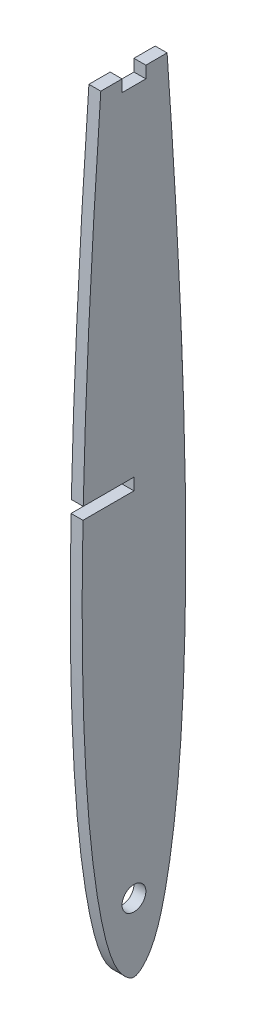
ISO-10303-21;
HEADER;
FILE_DESCRIPTION(('STEP AP214'),'2;1');
FILE_NAME('part.step','',(''),(''),'','','');
FILE_SCHEMA(('AUTOMOTIVE_DESIGN { 1 0 10303 214 1 1 1 1 }'));
ENDSEC;
DATA;
#1=APPLICATION_CONTEXT('core data for automotive mechanical design processes');
#2=APPLICATION_PROTOCOL_DEFINITION('international standard','automotive_design',2000,#1);
#3=PRODUCT_CONTEXT('',#1,'mechanical');
#4=PRODUCT('Part','Part','',(#3));
#5=PRODUCT_RELATED_PRODUCT_CATEGORY('part','',(#4));
#6=PRODUCT_DEFINITION_FORMATION('','',#4);
#7=PRODUCT_DEFINITION_CONTEXT('part definition',#1,'design');
#8=PRODUCT_DEFINITION('design','',#6,#7);
#9=PRODUCT_DEFINITION_SHAPE('','',#8);
#10=(LENGTH_UNIT() NAMED_UNIT(*) SI_UNIT(.MILLI.,.METRE.));
#11=(NAMED_UNIT(*) PLANE_ANGLE_UNIT() SI_UNIT($,.RADIAN.));
#12=(NAMED_UNIT(*) SI_UNIT($,.STERADIAN.) SOLID_ANGLE_UNIT());
#13=UNCERTAINTY_MEASURE_WITH_UNIT(LENGTH_MEASURE(1.E-05),#10,'distance_accuracy_value','');
#14=(GEOMETRIC_REPRESENTATION_CONTEXT(3) GLOBAL_UNCERTAINTY_ASSIGNED_CONTEXT((#13)) GLOBAL_UNIT_ASSIGNED_CONTEXT((#10,
#11,#12)) REPRESENTATION_CONTEXT('',''));
#15=CARTESIAN_POINT('',(0.,0.,0.));
#16=DIRECTION('',(0.,0.,1.));
#17=DIRECTION('',(1.,0.,0.));
#18=AXIS2_PLACEMENT_3D('',#15,#16,#17);
#19=CARTESIAN_POINT('',(2.,192.999999999996,0.));
#20=CARTESIAN_POINT('',(2.,192.999999999996,0.0122882837324172));
#21=CARTESIAN_POINT('',(2.,192.682209119406,0.0368603625393233));
#22=CARTESIAN_POINT('',(2.,192.460340024893,0.0736035981280797));
#23=CARTESIAN_POINT('',(2.,191.982517082908,0.134145604404998));
#24=CARTESIAN_POINT('',(2.,191.35712689456,0.216837902660677));
#25=CARTESIAN_POINT('',(2.,190.531582794813,0.320148771963968));
#26=CARTESIAN_POINT('',(2.,189.535054466325,0.442734222230249));
#27=CARTESIAN_POINT('',(2.,188.359470772641,0.583708337911787));
#28=CARTESIAN_POINT('',(2.,187.007350915561,0.741224014677529));
#29=CARTESIAN_POINT('',(2.,185.485486568902,0.913427429630669));
#30=CARTESIAN_POINT('',(2.,183.794042276915,1.09836703243003));
#31=CARTESIAN_POINT('',(2.,181.932788992912,1.29515347410631));
#32=CARTESIAN_POINT('',(2.,179.912860558566,1.50300146250267));
#33=CARTESIAN_POINT('',(2.,177.734330299035,1.72214268387852));
#34=CARTESIAN_POINT('',(2.,175.397073133111,1.95164554564491));
#35=CARTESIAN_POINT('',(2.,172.914023798966,2.18986236397919));
#36=CARTESIAN_POINT('',(2.,170.285170029632,2.4360379785976));
#37=CARTESIAN_POINT('',(2.,167.510432908496,2.68976393685841));
#38=CARTESIAN_POINT('',(2.,164.606175429361,2.9497692630301));
#39=CARTESIAN_POINT('',(2.,161.572442463531,3.21603940063296));
#40=CARTESIAN_POINT('',(2.,158.409161794966,3.48804758637527));
#41=CARTESIAN_POINT('',(2.,155.134176565915,3.76407067653143));
#42=CARTESIAN_POINT('',(2.,151.74751115159,4.04375761221832));
#43=CARTESIAN_POINT('',(2.,148.249059822729,4.32625514141405));
#44=CARTESIAN_POINT('',(2.,144.658859050905,4.60944176824801));
#45=CARTESIAN_POINT('',(2.,140.976882583283,4.89248180689964));
#46=CARTESIAN_POINT('',(2.,137.203080849863,5.17486350058964));
#47=CARTESIAN_POINT('',(2.,133.35917466741,5.4546919657911));
#48=CARTESIAN_POINT('',(2.,129.445182710772,5.73163620835846));
#49=CARTESIAN_POINT('',(2.,125.461027301494,6.00466344293629));
#50=CARTESIAN_POINT('',(2.,121.429287100518,6.27144725697884));
#51=CARTESIAN_POINT('',(2.,117.349948116966,6.53117208653237));
#52=CARTESIAN_POINT('',(2.,113.222962101861,6.78291788437563));
#53=CARTESIAN_POINT('',(2.,109.072183192628,7.02464837078236));
#54=CARTESIAN_POINT('',(2.,104.897612739011,7.25570143446052));
#55=CARTESIAN_POINT('',(2.,100.699220215205,7.47494003224479));
#56=CARTESIAN_POINT('',(2.,96.5008129920608,7.67999199939013));
#57=CARTESIAN_POINT('',(2.,92.3024038510146,7.87008389630309));
#58=CARTESIAN_POINT('',(2.,88.1039931250792,8.04421627274301));
#59=CARTESIAN_POINT('',(2.,83.9293445422882,8.20065920616125));
#60=CARTESIAN_POINT('',(2.,79.7784895837727,8.33891791382868));
#61=CARTESIAN_POINT('',(2.,75.6514851950594,8.45754103806901));
#62=CARTESIAN_POINT('',(2.,72.2285258109592,8.53880789846245));
#63=CARTESIAN_POINT('',(2.,69.5097037073785,8.59243723551273));
#64=CARTESIAN_POINT('',(2.,67.4954230531009,8.6266391374793));
#65=CARTESIAN_POINT('',(2.,65.4959197538743,8.65491322995059));
#66=CARTESIAN_POINT('',(2.,63.5112111157734,8.67715068352923));
#67=CARTESIAN_POINT('',(2.,61.5413152380111,8.6933644839582));
#68=CARTESIAN_POINT('',(2.,59.5889858960589,8.70334208652484));
#69=CARTESIAN_POINT('',(2.,57.6542349795604,8.70709498052642));
#70=CARTESIAN_POINT('',(2.,55.7370887158485,8.70416558992147));
#71=CARTESIAN_POINT('',(2.,53.8400779734036,8.69414750073762));
#72=CARTESIAN_POINT('',(2.,51.9632186508441,8.6766361371187));
#73=CARTESIAN_POINT('',(2.,50.1065481173563,8.65211427711133));
#74=CARTESIAN_POINT('',(2.,48.2727907844355,8.6209057194135));
#75=CARTESIAN_POINT('',(2.,46.4619703788477,8.58351289058314));
#76=CARTESIAN_POINT('',(2.,44.6741201445508,8.5394925233378));
#77=CARTESIAN_POINT('',(2.,42.9119721188135,8.48837471185198));
#78=CARTESIAN_POINT('',(2.,41.1755586173683,8.42988665253138));
#79=CARTESIAN_POINT('',(2.,39.4649156176666,8.36437553056901));
#80=CARTESIAN_POINT('',(2.,37.7821135133986,8.29189382911729));
#81=CARTESIAN_POINT('',(2.,36.1271623708862,8.21289710632799));
#82=CARTESIAN_POINT('',(2.,34.5001291909006,8.12703880180316));
#83=CARTESIAN_POINT('',(2.,32.9032901518417,8.03403827311851));
#84=CARTESIAN_POINT('',(2.,31.3366868352413,7.9338546606914));
#85=CARTESIAN_POINT('',(2.,29.8003674484855,7.82661127545427));
#86=CARTESIAN_POINT('',(2.,28.296372862938,7.71244910502318));
#87=CARTESIAN_POINT('',(2.,26.8247261445299,7.59165857196653));
#88=CARTESIAN_POINT('',(2.,25.3855159178605,7.46406729982454));
#89=CARTESIAN_POINT('',(2.,23.9807714623009,7.32941187546483));
#90=CARTESIAN_POINT('',(2.,22.6105597908823,7.18776406733445));
#91=CARTESIAN_POINT('',(2.,21.2749272087211,7.03945868904377));
#92=CARTESIAN_POINT('',(2.,19.9759448641313,6.88462546850703));
#93=CARTESIAN_POINT('',(2.,18.7136211045336,6.72376899430199));
#94=CARTESIAN_POINT('',(2.,17.4879895068422,6.55741985639288));
#95=CARTESIAN_POINT('',(2.,16.3002727488104,6.38575052807902));
#96=CARTESIAN_POINT('',(2.,15.1504575471703,6.20945689623311));
#97=CARTESIAN_POINT('',(2.,14.0386301287691,6.02862018447428));
#98=CARTESIAN_POINT('',(2.,12.9664026628353,5.84294628620977));
#99=CARTESIAN_POINT('',(2.,11.933787904783,5.65300784122468));
#100=CARTESIAN_POINT('',(2.,10.9409055928873,5.45879239792326));
#101=CARTESIAN_POINT('',(2.,9.98917364559678,5.25996794827365));
#102=CARTESIAN_POINT('',(2.,9.07860826703448,5.05719918066548));
#103=CARTESIAN_POINT('',(2.,8.20963683508739,4.84951643990115));
#104=CARTESIAN_POINT('',(2.,7.38246478289655,4.63526899547873));
#105=CARTESIAN_POINT('',(2.,6.59736117765083,4.41470405715055));
#106=CARTESIAN_POINT('',(2.,5.8548341958349,4.18729834254325));
#107=CARTESIAN_POINT('',(2.,5.1553355002252,3.95148814136902));
#108=CARTESIAN_POINT('',(2.,4.49921966377161,3.70830621175436));
#109=CARTESIAN_POINT('',(2.,3.88735235981548,3.45750483757036));
#110=CARTESIAN_POINT('',(2.,3.31904804370165,3.19652644303792));
#111=CARTESIAN_POINT('',(2.,2.79479836130484,2.92714629919864));
#112=CARTESIAN_POINT('',(2.,2.31501468244433,2.65081829109901));
#113=CARTESIAN_POINT('',(2.,1.88066799202441,2.36700042503805));
#114=CARTESIAN_POINT('',(2.,1.49161553692699,2.0794803000901));
#115=CARTESIAN_POINT('',(2.,1.14703863028777,1.79259355212741));
#116=CARTESIAN_POINT('',(2.,0.848541142058311,1.50916050979399));
#117=CARTESIAN_POINT('',(2.,0.59356979977649,1.23403833875503));
#118=CARTESIAN_POINT('',(2.,0.382804323969848,0.966592418412594));
#119=CARTESIAN_POINT('',(2.,0.218534665461119,0.705813072830733));
#120=CARTESIAN_POINT('',(2.,0.0973328530559555,0.459755647416888));
#121=CARTESIAN_POINT('',(2.,0.0209601562307941,0.234428054605721));
#122=CARTESIAN_POINT('',(2.,-0.0103600003933925,0.));
#123=CARTESIAN_POINT('',(2.,0.0209601562307948,-0.234428054605735));
#124=CARTESIAN_POINT('',(2.,0.0973328530559672,-0.459755647416913));
#125=CARTESIAN_POINT('',(2.,0.218534665461101,-0.7058130728307));
#126=CARTESIAN_POINT('',(2.,0.382804323969854,-0.966592418412604));
#127=CARTESIAN_POINT('',(2.,0.593569799776469,-1.234038338755));
#128=CARTESIAN_POINT('',(2.,0.848541142058344,-1.50916050979402));
#129=CARTESIAN_POINT('',(2.,1.14703863028776,-1.7925935521274));
#130=CARTESIAN_POINT('',(2.,1.49161553692698,-2.0794803000901));
#131=CARTESIAN_POINT('',(2.,1.8806679920244,-2.36700042503804));
#132=CARTESIAN_POINT('',(2.,2.31501468244434,-2.65081829109902));
#133=CARTESIAN_POINT('',(2.,2.79479836130484,-2.92714629919864));
#134=CARTESIAN_POINT('',(2.,3.31904804370166,-3.19652644303793));
#135=CARTESIAN_POINT('',(2.,3.88735235981545,-3.45750483757035));
#136=CARTESIAN_POINT('',(2.,4.49921966377162,-3.70830621175437));
#137=CARTESIAN_POINT('',(2.,5.15533550022522,-3.95148814136903));
#138=CARTESIAN_POINT('',(2.,5.85483419583486,-4.18729834254324));
#139=CARTESIAN_POINT('',(2.,6.59736117765089,-4.41470405715057));
#140=CARTESIAN_POINT('',(2.,7.38246478289652,-4.63526899547872));
#141=CARTESIAN_POINT('',(2.,8.20963683508738,-4.84951643990115));
#142=CARTESIAN_POINT('',(2.,9.0786082670345,-5.05719918066549));
#143=CARTESIAN_POINT('',(2.,9.98917364559673,-5.25996794827364));
#144=CARTESIAN_POINT('',(2.,10.9409055928874,-5.45879239792327));
#145=CARTESIAN_POINT('',(2.,11.9337879047829,-5.65300784122468));
#146=CARTESIAN_POINT('',(2.,12.9664026628353,-5.84294628620977));
#147=CARTESIAN_POINT('',(2.,14.0386301287691,-6.02862018447428));
#148=CARTESIAN_POINT('',(2.,15.1504575471703,-6.2094568962331));
#149=CARTESIAN_POINT('',(2.,16.3002727488105,-6.38575052807903));
#150=CARTESIAN_POINT('',(2.,17.4879895068422,-6.55741985639288));
#151=CARTESIAN_POINT('',(2.,18.7136211045336,-6.723768994302));
#152=CARTESIAN_POINT('',(2.,19.9759448641312,-6.88462546850702));
#153=CARTESIAN_POINT('',(2.,21.2749272087212,-7.03945868904377));
#154=CARTESIAN_POINT('',(2.,22.6105597908823,-7.18776406733445));
#155=CARTESIAN_POINT('',(2.,23.9807714623009,-7.32941187546483));
#156=CARTESIAN_POINT('',(2.,25.3855159178605,-7.46406729982454));
#157=CARTESIAN_POINT('',(2.,26.8247261445299,-7.59165857196654));
#158=CARTESIAN_POINT('',(2.,28.296372862938,-7.71244910502317));
#159=CARTESIAN_POINT('',(2.,29.8003674484855,-7.82661127545427));
#160=CARTESIAN_POINT('',(2.,31.3366868352412,-7.9338546606914));
#161=CARTESIAN_POINT('',(2.,32.9032901518418,-8.03403827311851));
#162=CARTESIAN_POINT('',(2.,34.5001291909006,-8.12703880180316));
#163=CARTESIAN_POINT('',(2.,36.1271623708863,-8.21289710632799));
#164=CARTESIAN_POINT('',(2.,37.7821135133986,-8.29189382911729));
#165=CARTESIAN_POINT('',(2.,39.4649156176666,-8.36437553056901));
#166=CARTESIAN_POINT('',(2.,41.1755586173684,-8.42988665253138));
#167=CARTESIAN_POINT('',(2.,42.9119721188135,-8.48837471185198));
#168=CARTESIAN_POINT('',(2.,44.6741201445507,-8.5394925233378));
#169=CARTESIAN_POINT('',(2.,46.4619703788477,-8.58351289058314));
#170=CARTESIAN_POINT('',(2.,48.2727907844355,-8.6209057194135));
#171=CARTESIAN_POINT('',(2.,50.1065481173563,-8.65211427711133));
#172=CARTESIAN_POINT('',(2.,51.9632186508441,-8.6766361371187));
#173=CARTESIAN_POINT('',(2.,53.8400779734036,-8.69414750073762));
#174=CARTESIAN_POINT('',(2.,55.7370887158486,-8.70416558992148));
#175=CARTESIAN_POINT('',(2.,57.6542349795603,-8.70709498052642));
#176=CARTESIAN_POINT('',(2.,59.5889858960588,-8.70334208652484));
#177=CARTESIAN_POINT('',(2.,61.5413152380112,-8.6933644839582));
#178=CARTESIAN_POINT('',(2.,63.5112111157734,-8.67715068352923));
#179=CARTESIAN_POINT('',(2.,65.4959197538743,-8.65491322995059));
#180=CARTESIAN_POINT('',(2.,67.4954230531009,-8.6266391374793));
#181=CARTESIAN_POINT('',(2.,69.5097037073786,-8.59243723551273));
#182=CARTESIAN_POINT('',(2.,72.2285258109591,-8.53880789846245));
#183=CARTESIAN_POINT('',(2.,75.6514851950594,-8.45754103806901));
#184=CARTESIAN_POINT('',(2.,79.7784895837727,-8.33891791382869));
#185=CARTESIAN_POINT('',(2.,83.9293445422883,-8.20065920616125));
#186=CARTESIAN_POINT('',(2.,88.1039931250791,-8.04421627274301));
#187=CARTESIAN_POINT('',(2.,92.3024038510146,-7.87008389630309));
#188=CARTESIAN_POINT('',(2.,96.5008129920608,-7.67999199939013));
#189=CARTESIAN_POINT('',(2.,100.699220215205,-7.47494003224479));
#190=CARTESIAN_POINT('',(2.,104.897612739012,-7.25570143446052));
#191=CARTESIAN_POINT('',(2.,109.072183192628,-7.02464837078236));
#192=CARTESIAN_POINT('',(2.,113.222962101861,-6.78291788437563));
#193=CARTESIAN_POINT('',(2.,117.349948116966,-6.53117208653237));
#194=CARTESIAN_POINT('',(2.,121.429287100517,-6.27144725697884));
#195=CARTESIAN_POINT('',(2.,125.461027301494,-6.00466344293629));
#196=CARTESIAN_POINT('',(2.,129.445182710772,-5.73163620835846));
#197=CARTESIAN_POINT('',(2.,133.35917466741,-5.4546919657911));
#198=CARTESIAN_POINT('',(2.,137.203080849863,-5.17486350058964));
#199=CARTESIAN_POINT('',(2.,140.976882583283,-4.89248180689964));
#200=CARTESIAN_POINT('',(2.,144.658859050905,-4.60944176824801));
#201=CARTESIAN_POINT('',(2.,148.249059822729,-4.32625514141406));
#202=CARTESIAN_POINT('',(2.,151.74751115159,-4.04375761221833));
#203=CARTESIAN_POINT('',(2.,155.134176565915,-3.76407067653143));
#204=CARTESIAN_POINT('',(2.,158.409161794966,-3.48804758637527));
#205=CARTESIAN_POINT('',(2.,161.572442463531,-3.21603940063295));
#206=CARTESIAN_POINT('',(2.,164.606175429361,-2.9497692630301));
#207=CARTESIAN_POINT('',(2.,167.510432908496,-2.68976393685841));
#208=CARTESIAN_POINT('',(2.,170.285170029632,-2.4360379785976));
#209=CARTESIAN_POINT('',(2.,172.914023798966,-2.18986236397919));
#210=CARTESIAN_POINT('',(2.,175.397073133111,-1.95164554564492));
#211=CARTESIAN_POINT('',(2.,177.734330299035,-1.72214268387852));
#212=CARTESIAN_POINT('',(2.,179.912860558567,-1.50300146250267));
#213=CARTESIAN_POINT('',(2.,181.932788992912,-1.2951534741063));
#214=CARTESIAN_POINT('',(2.,183.794042276915,-1.09836703243003));
#215=CARTESIAN_POINT('',(2.,185.485486568902,-0.913427429630666));
#216=CARTESIAN_POINT('',(2.,187.007350915561,-0.741224014677529));
#217=CARTESIAN_POINT('',(2.,188.359470772641,-0.583708337911791));
#218=CARTESIAN_POINT('',(2.,189.535054466325,-0.442734222230246));
#219=CARTESIAN_POINT('',(2.,190.531582794813,-0.320148771963971));
#220=CARTESIAN_POINT('',(2.,191.35712689456,-0.216837902660673));
#221=CARTESIAN_POINT('',(2.,191.982517082908,-0.134145604405003));
#222=CARTESIAN_POINT('',(2.,192.460340024893,-0.0736035981280761));
#223=CARTESIAN_POINT('',(2.,192.682209119405,-0.0368603625393292));
#224=CARTESIAN_POINT('',(2.,192.999999999996,-0.0122882837324157));
#225=CARTESIAN_POINT('',(2.,192.999999999996,0.));
#226=B_SPLINE_CURVE_WITH_KNOTS('',3,(#19,#20,#21,#22,#23,#24,#25,#26,#27,#28,#29,#30,#31,#32,
#33,#34,#35,#36,#37,#38,#39,#40,#41,#42,#43,#44,#45,#46,#47,#48,#49,#50,#51,#52,#53,#54,#55,#56,
#57,#58,#59,#60,#61,#62,#63,#64,#65,#66,#67,#68,#69,#70,#71,#72,#73,#74,#75,#76,#77,#78,#79,#80,
#81,#82,#83,#84,#85,#86,#87,#88,#89,#90,#91,#92,#93,#94,#95,#96,#97,#98,#99,#100,#101,#102,#103,
#104,#105,#106,#107,#108,#109,#110,#111,#112,#113,#114,#115,#116,#117,#118,#119,#120,#121,#122,
#123,#124,#125,#126,#127,#128,#129,#130,#131,#132,#133,#134,#135,#136,#137,#138,#139,#140,#141,
#142,#143,#144,#145,#146,#147,#148,#149,#150,#151,#152,#153,#154,#155,#156,#157,#158,#159,#160,
#161,#162,#163,#164,#165,#166,#167,#168,#169,#170,#171,#172,#173,#174,#175,#176,#177,#178,#179,
#180,#181,#182,#183,#184,#185,#186,#187,#188,#189,#190,#191,#192,#193,#194,#195,#196,#197,#198,
#199,#200,#201,#202,#203,#204,#205,#206,#207,#208,#209,#210,#211,#212,#213,#214,#215,#216,#217,
#218,#219,#220,#221,#222,#223,#224,#225),.UNSPECIFIED.,.T.,.F.,(4,1,1,1,1,1,1,1,1,1,1,1,1,1,1,1,
1,1,1,1,1,1,1,1,1,1,1,1,1,1,1,1,1,1,1,1,1,1,1,1,1,1,1,1,1,1,1,1,1,1,1,1,1,1,1,1,1,1,1,1,1,1,1,1,
1,1,1,1,1,1,1,1,1,1,1,1,1,1,1,1,1,1,1,1,1,1,1,1,1,1,1,1,1,1,1,1,1,1,1,1,1,1,1,1,1,1,1,1,1,1,1,1,
1,1,1,1,1,1,1,1,1,1,1,1,1,1,1,1,1,1,1,1,1,1,1,1,1,1,1,1,1,1,1,1,1,1,1,1,1,1,1,1,1,1,1,1,1,1,1,1,
1,1,1,1,1,1,1,1,1,1,1,1,1,1,1,1,1,1,1,1,1,1,1,1,1,1,1,1,1,1,1,1,1,1,1,1,1,1,1,1,1,1,1,1,4),(0.,
0.000711185839146075,0.00142211189669677,0.00213325230730564,0.0042515812083525,
0.00636919832710723,0.00848752581630524,0.0119730784810977,0.0154575214925995,0.018943038274788,
0.0237347539725595,0.0285248873387198,0.0333165732602391,0.0393291744293109,0.0453398328662282,
0.0513523993121445,0.0584858742146293,0.0656170397147716,0.072750532853801,0.0808789924662755,
0.089004858393096,0.097133324863051,0.106119170852942,0.115102077985534,0.124087938127177,
0.133776582105758,0.143462083798016,0.153150736130299,0.163374860583686,0.173595631908169,
0.183819725585906,0.194405238215812,0.204987270022769,0.215572756141474,0.226336088229742,
0.237095882839027,0.247859170721455,0.258617109640147,0.269371510550664,0.280129489501461,
0.290699718137812,0.30126655364532,0.311836760743931,0.316994414168611,0.32215042614633,
0.327308110630841,0.332351582468934,0.337393396633577,0.342436877180773,0.347345124659592,
0.352251771596133,0.35716003719228,0.361913828291535,0.366666142716989,0.371419982611637,
0.375998604797494,0.380575695772136,0.385154319352995,0.38953707828231,0.393918406516155,
0.398301185339692,0.402472485311891,0.406642416165932,0.410813696156181,0.414756499787741,
0.418698025118825,0.422640862362832,0.426339931904441,0.430037815255004,0.433736878150988,
0.437177345663826,0.440616660338539,0.444057116487179,0.447223685921861,0.450389262158133,
0.453555830037826,0.456439699558392,0.459322619339976,0.462206438132531,0.464796512065256,
0.467385720519806,0.469975829256052,0.472263128743875,0.474549688683252,0.476836911130722,
0.4788247572085,0.480812048429881,0.482800105251618,0.484492892915239,0.486185006152067,
0.487877314409996,0.489293868214825,0.490710106813471,0.49212744960716,0.493276037135274,
0.494423522715702,0.495568649395588,0.496434714112933,0.497302284253286,0.498179926351265,
0.498796407301135,0.499405098860122,0.5,0.500594901139878,0.501203592698865,0.501820073648735,
0.502697715746714,0.503565285887067,0.504431350604412,0.505576477284298,0.506723962864726,
0.50787255039284,0.509289893186529,0.510706131785175,0.512122685590004,0.513814993847933,
0.515507107084761,0.517199894748382,0.519187951570119,0.5211752427915,0.523163088869278,
0.525450311316748,0.527736871256125,0.530024170743948,0.532614279480194,0.535203487934744,
0.537793561867469,0.540677380660024,0.543560300441608,0.546444169962174,0.549610737841867,
0.552776314078139,0.555942883512821,0.559383339661461,0.562822654336174,0.566263121849012,
0.569962184744996,0.573660068095559,0.577359137637168,0.581301974881175,0.585243500212259,
0.589186303843819,0.593357583834067,0.597527514688109,0.601698814660308,0.606081593483844,
0.61046292171769,0.614845680647005,0.619424304227864,0.624001395202506,0.628580017388363,
0.633333857283011,0.638086171708465,0.64283996280772,0.647748228403867,0.652654875340408,
0.657563122819227,0.662606603366423,0.667648417531066,0.672691889369159,0.67784957385367,
0.683005585831389,0.688163239256069,0.69873344635468,0.709300281862188,0.719870510498539,
0.730628489449336,0.741382890359853,0.752140829278545,0.762904117160973,0.773663911770258,
0.784427243858526,0.795012729977231,0.805594761784188,0.816180274414094,0.826404368091831,
0.836625139416314,0.846849263869701,0.856537916201984,0.866223417894242,0.875912061872823,
0.884897922014465,0.893880829147057,0.902866675136949,0.910995141606904,0.919121007533724,
0.927249467146199,0.934382960285228,0.941514125785371,0.948647600687855,0.954660167133772,
0.960670825570689,0.966683426739761,0.97147511266128,0.97626524602744,0.981056961725212,
0.9845424785074,0.988026921518902,0.991512474183695,0.993630801672893,0.995748418791647,
0.997866747692694,0.998577888103303,0.999288814160854,1.),.UNSPECIFIED.);
#227=DIRECTION('',(-1.,0.,0.));
#228=VECTOR('',#227,1.);
#229=SURFACE_OF_LINEAR_EXTRUSION('',#226,#228);
#230=CARTESIAN_POINT('',(0.,192.999999999996,0.));
#231=CARTESIAN_POINT('',(0.,192.999999999996,0.0122882837324172));
#232=CARTESIAN_POINT('',(0.,192.682209119406,0.0368603625393233));
#233=CARTESIAN_POINT('',(0.,192.460340024893,0.0736035981280797));
#234=CARTESIAN_POINT('',(0.,191.982517082908,0.134145604404998));
#235=CARTESIAN_POINT('',(0.,191.35712689456,0.216837902660677));
#236=CARTESIAN_POINT('',(0.,190.531582794813,0.320148771963968));
#237=CARTESIAN_POINT('',(0.,189.535054466325,0.442734222230249));
#238=CARTESIAN_POINT('',(0.,188.359470772641,0.583708337911787));
#239=CARTESIAN_POINT('',(0.,187.007350915561,0.741224014677529));
#240=CARTESIAN_POINT('',(0.,185.485486568902,0.913427429630669));
#241=CARTESIAN_POINT('',(0.,183.794042276915,1.09836703243003));
#242=CARTESIAN_POINT('',(0.,181.932788992912,1.29515347410631));
#243=CARTESIAN_POINT('',(0.,179.912860558566,1.50300146250267));
#244=CARTESIAN_POINT('',(0.,177.734330299035,1.72214268387852));
#245=CARTESIAN_POINT('',(0.,175.397073133111,1.95164554564491));
#246=CARTESIAN_POINT('',(0.,172.914023798966,2.18986236397919));
#247=CARTESIAN_POINT('',(0.,170.285170029632,2.4360379785976));
#248=CARTESIAN_POINT('',(0.,167.510432908496,2.68976393685841));
#249=CARTESIAN_POINT('',(0.,164.606175429361,2.9497692630301));
#250=CARTESIAN_POINT('',(0.,161.572442463531,3.21603940063296));
#251=CARTESIAN_POINT('',(0.,158.409161794966,3.48804758637527));
#252=CARTESIAN_POINT('',(0.,155.134176565915,3.76407067653143));
#253=CARTESIAN_POINT('',(0.,151.74751115159,4.04375761221832));
#254=CARTESIAN_POINT('',(0.,148.249059822729,4.32625514141405));
#255=CARTESIAN_POINT('',(0.,144.658859050905,4.60944176824801));
#256=CARTESIAN_POINT('',(0.,140.976882583283,4.89248180689964));
#257=CARTESIAN_POINT('',(0.,137.203080849863,5.17486350058964));
#258=CARTESIAN_POINT('',(0.,133.35917466741,5.4546919657911));
#259=CARTESIAN_POINT('',(0.,129.445182710772,5.73163620835846));
#260=CARTESIAN_POINT('',(0.,125.461027301494,6.00466344293629));
#261=CARTESIAN_POINT('',(0.,121.429287100518,6.27144725697884));
#262=CARTESIAN_POINT('',(0.,117.349948116966,6.53117208653237));
#263=CARTESIAN_POINT('',(0.,113.222962101861,6.78291788437563));
#264=CARTESIAN_POINT('',(0.,109.072183192628,7.02464837078236));
#265=CARTESIAN_POINT('',(0.,104.897612739011,7.25570143446052));
#266=CARTESIAN_POINT('',(0.,100.699220215205,7.47494003224479));
#267=CARTESIAN_POINT('',(0.,96.5008129920608,7.67999199939013));
#268=CARTESIAN_POINT('',(0.,92.3024038510146,7.87008389630309));
#269=CARTESIAN_POINT('',(0.,88.1039931250792,8.04421627274301));
#270=CARTESIAN_POINT('',(0.,83.9293445422882,8.20065920616125));
#271=CARTESIAN_POINT('',(0.,79.7784895837727,8.33891791382868));
#272=CARTESIAN_POINT('',(0.,75.6514851950594,8.45754103806901));
#273=CARTESIAN_POINT('',(0.,72.2285258109592,8.53880789846245));
#274=CARTESIAN_POINT('',(0.,69.5097037073785,8.59243723551273));
#275=CARTESIAN_POINT('',(0.,67.4954230531009,8.6266391374793));
#276=CARTESIAN_POINT('',(0.,65.4959197538743,8.65491322995059));
#277=CARTESIAN_POINT('',(0.,63.5112111157734,8.67715068352923));
#278=CARTESIAN_POINT('',(0.,61.5413152380111,8.6933644839582));
#279=CARTESIAN_POINT('',(0.,59.5889858960589,8.70334208652484));
#280=CARTESIAN_POINT('',(0.,57.6542349795604,8.70709498052642));
#281=CARTESIAN_POINT('',(0.,55.7370887158485,8.70416558992147));
#282=CARTESIAN_POINT('',(0.,53.8400779734036,8.69414750073762));
#283=CARTESIAN_POINT('',(0.,51.9632186508441,8.6766361371187));
#284=CARTESIAN_POINT('',(0.,50.1065481173563,8.65211427711133));
#285=CARTESIAN_POINT('',(0.,48.2727907844355,8.6209057194135));
#286=CARTESIAN_POINT('',(0.,46.4619703788477,8.58351289058314));
#287=CARTESIAN_POINT('',(0.,44.6741201445508,8.5394925233378));
#288=CARTESIAN_POINT('',(0.,42.9119721188135,8.48837471185198));
#289=CARTESIAN_POINT('',(0.,41.1755586173683,8.42988665253138));
#290=CARTESIAN_POINT('',(0.,39.4649156176666,8.36437553056901));
#291=CARTESIAN_POINT('',(0.,37.7821135133986,8.29189382911729));
#292=CARTESIAN_POINT('',(0.,36.1271623708862,8.21289710632799));
#293=CARTESIAN_POINT('',(0.,34.5001291909006,8.12703880180316));
#294=CARTESIAN_POINT('',(0.,32.9032901518417,8.03403827311851));
#295=CARTESIAN_POINT('',(0.,31.3366868352413,7.9338546606914));
#296=CARTESIAN_POINT('',(0.,29.8003674484855,7.82661127545427));
#297=CARTESIAN_POINT('',(0.,28.296372862938,7.71244910502318));
#298=CARTESIAN_POINT('',(0.,26.8247261445299,7.59165857196653));
#299=CARTESIAN_POINT('',(0.,25.3855159178605,7.46406729982454));
#300=CARTESIAN_POINT('',(0.,23.9807714623009,7.32941187546483));
#301=CARTESIAN_POINT('',(0.,22.6105597908823,7.18776406733445));
#302=CARTESIAN_POINT('',(0.,21.2749272087211,7.03945868904377));
#303=CARTESIAN_POINT('',(0.,19.9759448641313,6.88462546850703));
#304=CARTESIAN_POINT('',(0.,18.7136211045336,6.72376899430199));
#305=CARTESIAN_POINT('',(0.,17.4879895068422,6.55741985639288));
#306=CARTESIAN_POINT('',(0.,16.3002727488104,6.38575052807902));
#307=CARTESIAN_POINT('',(0.,15.1504575471703,6.20945689623311));
#308=CARTESIAN_POINT('',(0.,14.0386301287691,6.02862018447428));
#309=CARTESIAN_POINT('',(0.,12.9664026628353,5.84294628620977));
#310=CARTESIAN_POINT('',(0.,11.933787904783,5.65300784122468));
#311=CARTESIAN_POINT('',(0.,10.9409055928873,5.45879239792326));
#312=CARTESIAN_POINT('',(0.,9.98917364559678,5.25996794827365));
#313=CARTESIAN_POINT('',(0.,9.07860826703448,5.05719918066548));
#314=CARTESIAN_POINT('',(0.,8.20963683508739,4.84951643990115));
#315=CARTESIAN_POINT('',(0.,7.38246478289655,4.63526899547873));
#316=CARTESIAN_POINT('',(0.,6.59736117765083,4.41470405715055));
#317=CARTESIAN_POINT('',(0.,5.8548341958349,4.18729834254325));
#318=CARTESIAN_POINT('',(0.,5.1553355002252,3.95148814136902));
#319=CARTESIAN_POINT('',(0.,4.49921966377161,3.70830621175436));
#320=CARTESIAN_POINT('',(0.,3.88735235981548,3.45750483757036));
#321=CARTESIAN_POINT('',(0.,3.31904804370165,3.19652644303792));
#322=CARTESIAN_POINT('',(0.,2.79479836130484,2.92714629919864));
#323=CARTESIAN_POINT('',(0.,2.31501468244433,2.65081829109901));
#324=CARTESIAN_POINT('',(0.,1.88066799202441,2.36700042503805));
#325=CARTESIAN_POINT('',(0.,1.49161553692699,2.0794803000901));
#326=CARTESIAN_POINT('',(0.,1.14703863028777,1.79259355212741));
#327=CARTESIAN_POINT('',(0.,0.848541142058311,1.50916050979399));
#328=CARTESIAN_POINT('',(0.,0.59356979977649,1.23403833875503));
#329=CARTESIAN_POINT('',(0.,0.382804323969848,0.966592418412594));
#330=CARTESIAN_POINT('',(0.,0.218534665461119,0.705813072830733));
#331=CARTESIAN_POINT('',(0.,0.0973328530559555,0.459755647416888));
#332=CARTESIAN_POINT('',(0.,0.0209601562307941,0.234428054605721));
#333=CARTESIAN_POINT('',(0.,-0.0103600003933925,0.));
#334=CARTESIAN_POINT('',(0.,0.0209601562307948,-0.234428054605735));
#335=CARTESIAN_POINT('',(0.,0.0973328530559672,-0.459755647416913));
#336=CARTESIAN_POINT('',(0.,0.218534665461101,-0.7058130728307));
#337=CARTESIAN_POINT('',(0.,0.382804323969854,-0.966592418412604));
#338=CARTESIAN_POINT('',(0.,0.593569799776469,-1.234038338755));
#339=CARTESIAN_POINT('',(0.,0.848541142058344,-1.50916050979402));
#340=CARTESIAN_POINT('',(0.,1.14703863028776,-1.7925935521274));
#341=CARTESIAN_POINT('',(0.,1.49161553692698,-2.0794803000901));
#342=CARTESIAN_POINT('',(0.,1.8806679920244,-2.36700042503804));
#343=CARTESIAN_POINT('',(0.,2.31501468244434,-2.65081829109902));
#344=CARTESIAN_POINT('',(0.,2.79479836130484,-2.92714629919864));
#345=CARTESIAN_POINT('',(0.,3.31904804370166,-3.19652644303793));
#346=CARTESIAN_POINT('',(0.,3.88735235981545,-3.45750483757035));
#347=CARTESIAN_POINT('',(0.,4.49921966377162,-3.70830621175437));
#348=CARTESIAN_POINT('',(0.,5.15533550022522,-3.95148814136903));
#349=CARTESIAN_POINT('',(0.,5.85483419583486,-4.18729834254324));
#350=CARTESIAN_POINT('',(0.,6.59736117765089,-4.41470405715057));
#351=CARTESIAN_POINT('',(0.,7.38246478289652,-4.63526899547872));
#352=CARTESIAN_POINT('',(0.,8.20963683508738,-4.84951643990115));
#353=CARTESIAN_POINT('',(0.,9.0786082670345,-5.05719918066549));
#354=CARTESIAN_POINT('',(0.,9.98917364559673,-5.25996794827364));
#355=CARTESIAN_POINT('',(0.,10.9409055928874,-5.45879239792327));
#356=CARTESIAN_POINT('',(0.,11.9337879047829,-5.65300784122468));
#357=CARTESIAN_POINT('',(0.,12.9664026628353,-5.84294628620977));
#358=CARTESIAN_POINT('',(0.,14.0386301287691,-6.02862018447428));
#359=CARTESIAN_POINT('',(0.,15.1504575471703,-6.2094568962331));
#360=CARTESIAN_POINT('',(0.,16.3002727488105,-6.38575052807903));
#361=CARTESIAN_POINT('',(0.,17.4879895068422,-6.55741985639288));
#362=CARTESIAN_POINT('',(0.,18.7136211045336,-6.723768994302));
#363=CARTESIAN_POINT('',(0.,19.9759448641312,-6.88462546850702));
#364=CARTESIAN_POINT('',(0.,21.2749272087212,-7.03945868904377));
#365=CARTESIAN_POINT('',(0.,22.6105597908823,-7.18776406733445));
#366=CARTESIAN_POINT('',(0.,23.9807714623009,-7.32941187546483));
#367=CARTESIAN_POINT('',(0.,25.3855159178605,-7.46406729982454));
#368=CARTESIAN_POINT('',(0.,26.8247261445299,-7.59165857196654));
#369=CARTESIAN_POINT('',(0.,28.296372862938,-7.71244910502317));
#370=CARTESIAN_POINT('',(0.,29.8003674484855,-7.82661127545427));
#371=CARTESIAN_POINT('',(0.,31.3366868352412,-7.9338546606914));
#372=CARTESIAN_POINT('',(0.,32.9032901518418,-8.03403827311851));
#373=CARTESIAN_POINT('',(0.,34.5001291909006,-8.12703880180316));
#374=CARTESIAN_POINT('',(0.,36.1271623708863,-8.21289710632799));
#375=CARTESIAN_POINT('',(0.,37.7821135133986,-8.29189382911729));
#376=CARTESIAN_POINT('',(0.,39.4649156176666,-8.36437553056901));
#377=CARTESIAN_POINT('',(0.,41.1755586173684,-8.42988665253138));
#378=CARTESIAN_POINT('',(0.,42.9119721188135,-8.48837471185198));
#379=CARTESIAN_POINT('',(0.,44.6741201445507,-8.5394925233378));
#380=CARTESIAN_POINT('',(0.,46.4619703788477,-8.58351289058314));
#381=CARTESIAN_POINT('',(0.,48.2727907844355,-8.6209057194135));
#382=CARTESIAN_POINT('',(0.,50.1065481173563,-8.65211427711133));
#383=CARTESIAN_POINT('',(0.,51.9632186508441,-8.6766361371187));
#384=CARTESIAN_POINT('',(0.,53.8400779734036,-8.69414750073762));
#385=CARTESIAN_POINT('',(0.,55.7370887158486,-8.70416558992148));
#386=CARTESIAN_POINT('',(0.,57.6542349795603,-8.70709498052642));
#387=CARTESIAN_POINT('',(0.,59.5889858960588,-8.70334208652484));
#388=CARTESIAN_POINT('',(0.,61.5413152380112,-8.6933644839582));
#389=CARTESIAN_POINT('',(0.,63.5112111157734,-8.67715068352923));
#390=CARTESIAN_POINT('',(0.,65.4959197538743,-8.65491322995059));
#391=CARTESIAN_POINT('',(0.,67.4954230531009,-8.6266391374793));
#392=CARTESIAN_POINT('',(0.,69.5097037073786,-8.59243723551273));
#393=CARTESIAN_POINT('',(0.,72.2285258109591,-8.53880789846245));
#394=CARTESIAN_POINT('',(0.,75.6514851950594,-8.45754103806901));
#395=CARTESIAN_POINT('',(0.,79.7784895837727,-8.33891791382869));
#396=CARTESIAN_POINT('',(0.,83.9293445422883,-8.20065920616125));
#397=CARTESIAN_POINT('',(0.,88.1039931250791,-8.04421627274301));
#398=CARTESIAN_POINT('',(0.,92.3024038510146,-7.87008389630309));
#399=CARTESIAN_POINT('',(0.,96.5008129920608,-7.67999199939013));
#400=CARTESIAN_POINT('',(0.,100.699220215205,-7.47494003224479));
#401=CARTESIAN_POINT('',(0.,104.897612739012,-7.25570143446052));
#402=CARTESIAN_POINT('',(0.,109.072183192628,-7.02464837078236));
#403=CARTESIAN_POINT('',(0.,113.222962101861,-6.78291788437563));
#404=CARTESIAN_POINT('',(0.,117.349948116966,-6.53117208653237));
#405=CARTESIAN_POINT('',(0.,121.429287100517,-6.27144725697884));
#406=CARTESIAN_POINT('',(0.,125.461027301494,-6.00466344293629));
#407=CARTESIAN_POINT('',(0.,129.445182710772,-5.73163620835846));
#408=CARTESIAN_POINT('',(0.,133.35917466741,-5.4546919657911));
#409=CARTESIAN_POINT('',(0.,137.203080849863,-5.17486350058964));
#410=CARTESIAN_POINT('',(0.,140.976882583283,-4.89248180689964));
#411=CARTESIAN_POINT('',(0.,144.658859050905,-4.60944176824801));
#412=CARTESIAN_POINT('',(0.,148.249059822729,-4.32625514141406));
#413=CARTESIAN_POINT('',(0.,151.74751115159,-4.04375761221833));
#414=CARTESIAN_POINT('',(0.,155.134176565915,-3.76407067653143));
#415=CARTESIAN_POINT('',(0.,158.409161794966,-3.48804758637527));
#416=CARTESIAN_POINT('',(0.,161.572442463531,-3.21603940063295));
#417=CARTESIAN_POINT('',(0.,164.606175429361,-2.9497692630301));
#418=CARTESIAN_POINT('',(0.,167.510432908496,-2.68976393685841));
#419=CARTESIAN_POINT('',(0.,170.285170029632,-2.4360379785976));
#420=CARTESIAN_POINT('',(0.,172.914023798966,-2.18986236397919));
#421=CARTESIAN_POINT('',(0.,175.397073133111,-1.95164554564492));
#422=CARTESIAN_POINT('',(0.,177.734330299035,-1.72214268387852));
#423=CARTESIAN_POINT('',(0.,179.912860558567,-1.50300146250267));
#424=CARTESIAN_POINT('',(0.,181.932788992912,-1.2951534741063));
#425=CARTESIAN_POINT('',(0.,183.794042276915,-1.09836703243003));
#426=CARTESIAN_POINT('',(0.,185.485486568902,-0.913427429630666));
#427=CARTESIAN_POINT('',(0.,187.007350915561,-0.741224014677529));
#428=CARTESIAN_POINT('',(0.,188.359470772641,-0.583708337911791));
#429=CARTESIAN_POINT('',(0.,189.535054466325,-0.442734222230246));
#430=CARTESIAN_POINT('',(0.,190.531582794813,-0.320148771963971));
#431=CARTESIAN_POINT('',(0.,191.35712689456,-0.216837902660673));
#432=CARTESIAN_POINT('',(0.,191.982517082908,-0.134145604405003));
#433=CARTESIAN_POINT('',(0.,192.460340024893,-0.0736035981280761));
#434=CARTESIAN_POINT('',(0.,192.682209119405,-0.0368603625393292));
#435=CARTESIAN_POINT('',(0.,192.999999999996,-0.0122882837324157));
#436=CARTESIAN_POINT('',(0.,192.999999999996,0.));
#437=B_SPLINE_CURVE_WITH_KNOTS('',3,(#230,#231,#232,#233,#234,#235,#236,#237,#238,#239,#240,
#241,#242,#243,#244,#245,#246,#247,#248,#249,#250,#251,#252,#253,#254,#255,#256,#257,#258,#259,
#260,#261,#262,#263,#264,#265,#266,#267,#268,#269,#270,#271,#272,#273,#274,#275,#276,#277,#278,
#279,#280,#281,#282,#283,#284,#285,#286,#287,#288,#289,#290,#291,#292,#293,#294,#295,#296,#297,
#298,#299,#300,#301,#302,#303,#304,#305,#306,#307,#308,#309,#310,#311,#312,#313,#314,#315,#316,
#317,#318,#319,#320,#321,#322,#323,#324,#325,#326,#327,#328,#329,#330,#331,#332,#333,#334,#335,
#336,#337,#338,#339,#340,#341,#342,#343,#344,#345,#346,#347,#348,#349,#350,#351,#352,#353,#354,
#355,#356,#357,#358,#359,#360,#361,#362,#363,#364,#365,#366,#367,#368,#369,#370,#371,#372,#373,
#374,#375,#376,#377,#378,#379,#380,#381,#382,#383,#384,#385,#386,#387,#388,#389,#390,#391,#392,
#393,#394,#395,#396,#397,#398,#399,#400,#401,#402,#403,#404,#405,#406,#407,#408,#409,#410,#411,
#412,#413,#414,#415,#416,#417,#418,#419,#420,#421,#422,#423,#424,#425,#426,#427,#428,#429,#430,
#431,#432,#433,#434,#435,#436),.UNSPECIFIED.,.T.,.F.,(4,1,1,1,1,1,1,1,1,1,1,1,1,1,1,1,1,1,1,1,1,
1,1,1,1,1,1,1,1,1,1,1,1,1,1,1,1,1,1,1,1,1,1,1,1,1,1,1,1,1,1,1,1,1,1,1,1,1,1,1,1,1,1,1,1,1,1,1,1,
1,1,1,1,1,1,1,1,1,1,1,1,1,1,1,1,1,1,1,1,1,1,1,1,1,1,1,1,1,1,1,1,1,1,1,1,1,1,1,1,1,1,1,1,1,1,1,1,
1,1,1,1,1,1,1,1,1,1,1,1,1,1,1,1,1,1,1,1,1,1,1,1,1,1,1,1,1,1,1,1,1,1,1,1,1,1,1,1,1,1,1,1,1,1,1,1,
1,1,1,1,1,1,1,1,1,1,1,1,1,1,1,1,1,1,1,1,1,1,1,1,1,1,1,1,1,1,1,1,1,1,1,1,1,1,1,4),(0.,
0.000711185839146075,0.00142211189669677,0.00213325230730564,0.0042515812083525,
0.00636919832710723,0.00848752581630524,0.0119730784810977,0.0154575214925995,0.018943038274788,
0.0237347539725595,0.0285248873387198,0.0333165732602391,0.0393291744293109,0.0453398328662282,
0.0513523993121445,0.0584858742146293,0.0656170397147716,0.072750532853801,0.0808789924662755,
0.089004858393096,0.097133324863051,0.106119170852942,0.115102077985534,0.124087938127177,
0.133776582105758,0.143462083798016,0.153150736130299,0.163374860583686,0.173595631908169,
0.183819725585906,0.194405238215812,0.204987270022769,0.215572756141474,0.226336088229742,
0.237095882839027,0.247859170721455,0.258617109640147,0.269371510550664,0.280129489501461,
0.290699718137812,0.30126655364532,0.311836760743931,0.316994414168611,0.32215042614633,
0.327308110630841,0.332351582468934,0.337393396633577,0.342436877180773,0.347345124659592,
0.352251771596133,0.35716003719228,0.361913828291535,0.366666142716989,0.371419982611637,
0.375998604797494,0.380575695772136,0.385154319352995,0.38953707828231,0.393918406516155,
0.398301185339692,0.402472485311891,0.406642416165932,0.410813696156181,0.414756499787741,
0.418698025118825,0.422640862362832,0.426339931904441,0.430037815255004,0.433736878150988,
0.437177345663826,0.440616660338539,0.444057116487179,0.447223685921861,0.450389262158133,
0.453555830037826,0.456439699558392,0.459322619339976,0.462206438132531,0.464796512065256,
0.467385720519806,0.469975829256052,0.472263128743875,0.474549688683252,0.476836911130722,
0.4788247572085,0.480812048429881,0.482800105251618,0.484492892915239,0.486185006152067,
0.487877314409996,0.489293868214825,0.490710106813471,0.49212744960716,0.493276037135274,
0.494423522715702,0.495568649395588,0.496434714112933,0.497302284253286,0.498179926351265,
0.498796407301135,0.499405098860122,0.5,0.500594901139878,0.501203592698865,0.501820073648735,
0.502697715746714,0.503565285887067,0.504431350604412,0.505576477284298,0.506723962864726,
0.50787255039284,0.509289893186529,0.510706131785175,0.512122685590004,0.513814993847933,
0.515507107084761,0.517199894748382,0.519187951570119,0.5211752427915,0.523163088869278,
0.525450311316748,0.527736871256125,0.530024170743948,0.532614279480194,0.535203487934744,
0.537793561867469,0.540677380660024,0.543560300441608,0.546444169962174,0.549610737841867,
0.552776314078139,0.555942883512821,0.559383339661461,0.562822654336174,0.566263121849012,
0.569962184744996,0.573660068095559,0.577359137637168,0.581301974881175,0.585243500212259,
0.589186303843819,0.593357583834067,0.597527514688109,0.601698814660308,0.606081593483844,
0.61046292171769,0.614845680647005,0.619424304227864,0.624001395202506,0.628580017388363,
0.633333857283011,0.638086171708465,0.64283996280772,0.647748228403867,0.652654875340408,
0.657563122819227,0.662606603366423,0.667648417531066,0.672691889369159,0.67784957385367,
0.683005585831389,0.688163239256069,0.69873344635468,0.709300281862188,0.719870510498539,
0.730628489449336,0.741382890359853,0.752140829278545,0.762904117160973,0.773663911770258,
0.784427243858526,0.795012729977231,0.805594761784188,0.816180274414094,0.826404368091831,
0.836625139416314,0.846849263869701,0.856537916201984,0.866223417894242,0.875912061872823,
0.884897922014465,0.893880829147057,0.902866675136949,0.910995141606904,0.919121007533724,
0.927249467146199,0.934382960285228,0.941514125785371,0.948647600687855,0.954660167133772,
0.960670825570689,0.966683426739761,0.97147511266128,0.97626524602744,0.981056961725212,
0.9845424785074,0.988026921518902,0.991512474183695,0.993630801672893,0.995748418791647,
0.997866747692694,0.998577888103303,0.999288814160854,1.),.UNSPECIFIED.);
#438=CARTESIAN_POINT('',(0.,70.763840142204,8.56743608784101));
#439=VERTEX_POINT('',#438);
#440=CARTESIAN_POINT('',(0.,131.716510891703,-5.5705472627077));
#441=VERTEX_POINT('',#440);
#442=EDGE_CURVE('E161',#439,#441,#437,.T.);
#443=ORIENTED_EDGE('',*,*,#442,.T.);
#444=DIRECTION('',(1.,0.,0.));
#445=VECTOR('',#444,1.);
#446=CARTESIAN_POINT('',(-8.,131.716510891703,-5.5705472627077));
#447=LINE('',#446,#445);
#448=CARTESIAN_POINT('',(2.,131.716510891703,-5.5705472627077));
#449=VERTEX_POINT('',#448);
#450=EDGE_CURVE('E202',#441,#449,#447,.T.);
#451=ORIENTED_EDGE('',*,*,#450,.T.);
#452=CARTESIAN_POINT('',(2.,70.763840142204,8.56743608784101));
#453=VERTEX_POINT('',#452);
#454=EDGE_CURVE('E146',#453,#449,#226,.T.);
#455=ORIENTED_EDGE('',*,*,#454,.F.);
#456=DIRECTION('',(1.,0.,0.));
#457=VECTOR('',#456,1.);
#458=CARTESIAN_POINT('',(-8.,70.763840142204,8.56743608784101));
#459=LINE('',#458,#457);
#460=EDGE_CURVE('E217',#439,#453,#459,.T.);
#461=ORIENTED_EDGE('',*,*,#460,.F.);
#462=EDGE_LOOP('',(#443,#451,#455,#461));
#463=FACE_BOUND('',#462,.T.);
#464=ADVANCED_FACE('F45',(#463),#229,.F.);
#465=CARTESIAN_POINT('',(2.,131.716510882696,5.57054726334621));
#466=VERTEX_POINT('',#465);
#467=CARTESIAN_POINT('',(2.,72.7638401431248,8.52473329208654));
#468=VERTEX_POINT('',#467);
#469=EDGE_CURVE('E137',#466,#468,#226,.T.);
#470=ORIENTED_EDGE('',*,*,#469,.F.);
#471=DIRECTION('',(1.,0.,0.));
#472=VECTOR('',#471,1.);
#473=CARTESIAN_POINT('',(-8.,131.716510882696,5.57054726334621));
#474=LINE('',#473,#472);
#475=CARTESIAN_POINT('',(0.,131.716510882696,5.57054726334621));
#476=VERTEX_POINT('',#475);
#477=EDGE_CURVE('E119',#476,#466,#474,.T.);
#478=ORIENTED_EDGE('',*,*,#477,.F.);
#479=CARTESIAN_POINT('',(0.,72.7638401431248,8.52473329208654));
#480=VERTEX_POINT('',#479);
#481=EDGE_CURVE('E149',#476,#480,#437,.T.);
#482=ORIENTED_EDGE('',*,*,#481,.T.);
#483=DIRECTION('',(1.,0.,0.));
#484=VECTOR('',#483,1.);
#485=CARTESIAN_POINT('',(-8.,72.7638401431248,8.52473329208654));
#486=LINE('',#485,#484);
#487=EDGE_CURVE('E144',#480,#468,#486,.T.);
#488=ORIENTED_EDGE('',*,*,#487,.T.);
#489=EDGE_LOOP('',(#470,#478,#482,#488));
#490=FACE_BOUND('',#489,.T.);
#491=ADVANCED_FACE('F143',(#490),#229,.F.);
#492=CARTESIAN_POINT('',(2.,0.,0.));
#493=DIRECTION('',(-1.,0.,0.));
#494=DIRECTION('',(0.,0.,1.));
#495=AXIS2_PLACEMENT_3D('',#492,#493,#494);
#496=PLANE('',#495);
#497=CARTESIAN_POINT('',(2.,11.4900637938345,0.));
#498=DIRECTION('',(1.,0.,0.));
#499=DIRECTION('',(0.,0.,-1.));
#500=AXIS2_PLACEMENT_3D('',#497,#498,#499);
#501=CIRCLE('',#500,2.);
#502=CARTESIAN_POINT('',(2.,11.4900637938345,-2.));
#503=VERTEX_POINT('',#502);
#504=EDGE_CURVE('E211',#503,#503,#501,.T.);
#505=ORIENTED_EDGE('',*,*,#504,.F.);
#506=EDGE_LOOP('',(#505));
#507=FACE_BOUND('',#506,.T.);
#508=ORIENTED_EDGE('',*,*,#454,.T.);
#509=DIRECTION('',(0.,0.,-1.));
#510=VECTOR('',#509,1.);
#511=CARTESIAN_POINT('',(2.,131.716510891706,9.13966894470386E-13));
#512=LINE('',#511,#510);
#513=CARTESIAN_POINT('',(2.,131.716510891706,-2.00000000000001));
#514=VERTEX_POINT('',#513);
#515=EDGE_CURVE('E130',#514,#449,#512,.T.);
#516=ORIENTED_EDGE('',*,*,#515,.F.);
#517=DIRECTION('',(0.,-1.,0.));
#518=VECTOR('',#517,1.);
#519=CARTESIAN_POINT('',(2.,0.,-2.00000000000004));
#520=LINE('',#519,#518);
#521=CARTESIAN_POINT('',(2.,129.716510891704,-2.00000000000001));
#522=VERTEX_POINT('',#521);
#523=EDGE_CURVE('E232',#514,#522,#520,.T.);
#524=ORIENTED_EDGE('',*,*,#523,.T.);
#525=DIRECTION('',(0.,0.,-1.));
#526=VECTOR('',#525,1.);
#527=CARTESIAN_POINT('',(2.,129.716510891704,-8.10080195996307E-12));
#528=LINE('',#527,#526);
#529=CARTESIAN_POINT('',(2.,129.716510891705,1.99999999999999));
#530=VERTEX_POINT('',#529);
#531=EDGE_CURVE('E198',#530,#522,#528,.T.);
#532=ORIENTED_EDGE('',*,*,#531,.F.);
#533=DIRECTION('',(0.,-1.,0.));
#534=VECTOR('',#533,1.);
#535=CARTESIAN_POINT('',(2.,0.,1.99999999999999));
#536=LINE('',#535,#534);
#537=CARTESIAN_POINT('',(2.,131.716510891706,1.99999999999999));
#538=VERTEX_POINT('',#537);
#539=EDGE_CURVE('E140',#538,#530,#536,.T.);
#540=ORIENTED_EDGE('',*,*,#539,.F.);
#541=DIRECTION('',(0.,0.,-1.));
#542=VECTOR('',#541,1.);
#543=CARTESIAN_POINT('',(2.,131.716510891706,6.56285173694886E-13));
#544=LINE('',#543,#542);
#545=EDGE_CURVE('E122',#466,#538,#544,.T.);
#546=ORIENTED_EDGE('',*,*,#545,.F.);
#547=ORIENTED_EDGE('',*,*,#469,.T.);
#548=DIRECTION('',(0.,0.,-1.));
#549=VECTOR('',#548,1.);
#550=CARTESIAN_POINT('',(2.,72.7638401518415,0.));
#551=LINE('',#550,#549);
#552=CARTESIAN_POINT('',(2.,72.7638401518415,0.));
#553=VERTEX_POINT('',#552);
#554=EDGE_CURVE('E208',#468,#553,#551,.T.);
#555=ORIENTED_EDGE('',*,*,#554,.T.);
#556=DIRECTION('',(0.,1.,0.));
#557=VECTOR('',#556,1.);
#558=CARTESIAN_POINT('',(2.,0.,0.));
#559=LINE('',#558,#557);
#560=CARTESIAN_POINT('',(2.,70.7638401518415,0.));
#561=VERTEX_POINT('',#560);
#562=EDGE_CURVE('E213',#561,#553,#559,.T.);
#563=ORIENTED_EDGE('',*,*,#562,.F.);
#564=DIRECTION('',(0.,0.,-1.));
#565=VECTOR('',#564,1.);
#566=CARTESIAN_POINT('',(2.,70.7638401518415,0.));
#567=LINE('',#566,#565);
#568=EDGE_CURVE('E210',#453,#561,#567,.T.);
#569=ORIENTED_EDGE('',*,*,#568,.F.);
#570=EDGE_LOOP('',(#508,#516,#524,#532,#540,#546,#547,#555,#563,#569));
#571=FACE_BOUND('',#570,.T.);
#572=ADVANCED_FACE('F135',(#507,#571),#496,.F.);
#573=CARTESIAN_POINT('',(0.,0.,0.));
#574=DIRECTION('',(-1.,0.,0.));
#575=DIRECTION('',(0.,0.,1.));
#576=AXIS2_PLACEMENT_3D('',#573,#574,#575);
#577=PLANE('',#576);
#578=DIRECTION('',(0.,0.,1.));
#579=VECTOR('',#578,1.);
#580=CARTESIAN_POINT('',(0.,131.716510891706,9.35676698656892E-13));
#581=LINE('',#580,#579);
#582=CARTESIAN_POINT('',(0.,131.716510891706,-2.00000000000001));
#583=VERTEX_POINT('',#582);
#584=EDGE_CURVE('E12',#441,#583,#581,.T.);
#585=ORIENTED_EDGE('',*,*,#584,.F.);
#586=ORIENTED_EDGE('',*,*,#442,.F.);
#587=DIRECTION('',(0.,0.,1.));
#588=VECTOR('',#587,1.);
#589=CARTESIAN_POINT('',(0.,70.7638401518415,0.));
#590=LINE('',#589,#588);
#591=CARTESIAN_POINT('',(0.,70.7638401518415,0.));
#592=VERTEX_POINT('',#591);
#593=EDGE_CURVE('E145',#592,#439,#590,.T.);
#594=ORIENTED_EDGE('',*,*,#593,.F.);
#595=DIRECTION('',(0.,-1.,0.));
#596=VECTOR('',#595,1.);
#597=CARTESIAN_POINT('',(0.,0.,0.));
#598=LINE('',#597,#596);
#599=CARTESIAN_POINT('',(0.,72.7638401518415,0.));
#600=VERTEX_POINT('',#599);
#601=EDGE_CURVE('E147',#600,#592,#598,.T.);
#602=ORIENTED_EDGE('',*,*,#601,.F.);
#603=DIRECTION('',(0.,0.,1.));
#604=VECTOR('',#603,1.);
#605=CARTESIAN_POINT('',(0.,72.7638401518415,0.));
#606=LINE('',#605,#604);
#607=EDGE_CURVE('E167',#600,#480,#606,.T.);
#608=ORIENTED_EDGE('',*,*,#607,.T.);
#609=ORIENTED_EDGE('',*,*,#481,.F.);
#610=DIRECTION('',(0.,0.,1.));
#611=VECTOR('',#610,1.);
#612=CARTESIAN_POINT('',(0.,131.716510891706,6.77994977881391E-13));
#613=LINE('',#612,#611);
#614=CARTESIAN_POINT('',(0.,131.716510891706,1.99999999999999));
#615=VERTEX_POINT('',#614);
#616=EDGE_CURVE('E125',#615,#476,#613,.T.);
#617=ORIENTED_EDGE('',*,*,#616,.F.);
#618=DIRECTION('',(0.,1.,0.));
#619=VECTOR('',#618,1.);
#620=CARTESIAN_POINT('',(0.,0.,1.99999999999999));
#621=LINE('',#620,#619);
#622=CARTESIAN_POINT('',(0.,129.716510891705,1.99999999999999));
#623=VERTEX_POINT('',#622);
#624=EDGE_CURVE('E175',#623,#615,#621,.T.);
#625=ORIENTED_EDGE('',*,*,#624,.F.);
#626=DIRECTION('',(0.,0.,1.));
#627=VECTOR('',#626,1.);
#628=CARTESIAN_POINT('',(0.,129.716510891704,-8.07909215577657E-12));
#629=LINE('',#628,#627);
#630=CARTESIAN_POINT('',(0.,129.716510891704,-2.00000000000001));
#631=VERTEX_POINT('',#630);
#632=EDGE_CURVE('E177',#631,#623,#629,.T.);
#633=ORIENTED_EDGE('',*,*,#632,.F.);
#634=DIRECTION('',(0.,1.,0.));
#635=VECTOR('',#634,1.);
#636=CARTESIAN_POINT('',(0.,0.,-2.00000000000004));
#637=LINE('',#636,#635);
#638=EDGE_CURVE('E53',#631,#583,#637,.T.);
#639=ORIENTED_EDGE('',*,*,#638,.T.);
#640=EDGE_LOOP('',(#585,#586,#594,#602,#608,#609,#617,#625,#633,#639));
#641=FACE_BOUND('',#640,.T.);
#642=CARTESIAN_POINT('',(0.,11.4900637938345,0.));
#643=DIRECTION('',(-1.,0.,0.));
#644=DIRECTION('',(0.,0.,1.));
#645=AXIS2_PLACEMENT_3D('',#642,#643,#644);
#646=CIRCLE('',#645,2.);
#647=CARTESIAN_POINT('',(0.,11.4900637938345,2.));
#648=VERTEX_POINT('',#647);
#649=EDGE_CURVE('E170',#648,#648,#646,.T.);
#650=ORIENTED_EDGE('',*,*,#649,.F.);
#651=EDGE_LOOP('',(#650));
#652=FACE_BOUND('',#651,.T.);
#653=ADVANCED_FACE('F182',(#641,#652),#577,.T.);
#654=CARTESIAN_POINT('',(-8.,72.7638401518415,0.));
#655=DIRECTION('',(0.,-1.,0.));
#656=DIRECTION('',(0.,0.,-1.));
#657=AXIS2_PLACEMENT_3D('',#654,#655,#656);
#658=PLANE('',#657);
#659=DIRECTION('',(1.,0.,0.));
#660=VECTOR('',#659,1.);
#661=CARTESIAN_POINT('',(-8.,72.7638401518415,0.));
#662=LINE('',#661,#660);
#663=EDGE_CURVE('E173',#600,#553,#662,.T.);
#664=ORIENTED_EDGE('',*,*,#663,.T.);
#665=ORIENTED_EDGE('',*,*,#554,.F.);
#666=ORIENTED_EDGE('',*,*,#487,.F.);
#667=ORIENTED_EDGE('',*,*,#607,.F.);
#668=EDGE_LOOP('',(#664,#665,#666,#667));
#669=FACE_BOUND('',#668,.T.);
#670=ADVANCED_FACE('F260',(#669),#658,.T.);
#671=CARTESIAN_POINT('',(-8.,0.,0.));
#672=DIRECTION('',(0.,0.,-1.));
#673=DIRECTION('',(0.,1.,0.));
#674=AXIS2_PLACEMENT_3D('',#671,#672,#673);
#675=PLANE('',#674);
#676=ORIENTED_EDGE('',*,*,#601,.T.);
#677=DIRECTION('',(1.,0.,0.));
#678=VECTOR('',#677,1.);
#679=CARTESIAN_POINT('',(-8.,70.7638401518415,0.));
#680=LINE('',#679,#678);
#681=EDGE_CURVE('E68',#592,#561,#680,.T.);
#682=ORIENTED_EDGE('',*,*,#681,.T.);
#683=ORIENTED_EDGE('',*,*,#562,.T.);
#684=ORIENTED_EDGE('',*,*,#663,.F.);
#685=EDGE_LOOP('',(#676,#682,#683,#684));
#686=FACE_BOUND('',#685,.T.);
#687=ADVANCED_FACE('F265',(#686),#675,.F.);
#688=CARTESIAN_POINT('',(-8.,70.7638401518415,0.));
#689=DIRECTION('',(0.,-1.,0.));
#690=DIRECTION('',(0.,0.,-1.));
#691=AXIS2_PLACEMENT_3D('',#688,#689,#690);
#692=PLANE('',#691);
#693=ORIENTED_EDGE('',*,*,#593,.T.);
#694=ORIENTED_EDGE('',*,*,#460,.T.);
#695=ORIENTED_EDGE('',*,*,#568,.T.);
#696=ORIENTED_EDGE('',*,*,#681,.F.);
#697=EDGE_LOOP('',(#693,#694,#695,#696));
#698=FACE_BOUND('',#697,.T.);
#699=ADVANCED_FACE('F220',(#698),#692,.F.);
#700=CARTESIAN_POINT('',(-8.,11.4900637938345,0.));
#701=DIRECTION('',(1.,0.,0.));
#702=DIRECTION('',(0.,0.,-1.));
#703=AXIS2_PLACEMENT_3D('',#700,#701,#702);
#704=CYLINDRICAL_SURFACE('',#703,2.);
#705=ORIENTED_EDGE('',*,*,#649,.T.);
#706=EDGE_LOOP('',(#705));
#707=FACE_BOUND('',#706,.T.);
#708=ORIENTED_EDGE('',*,*,#504,.T.);
#709=EDGE_LOOP('',(#708));
#710=FACE_BOUND('',#709,.T.);
#711=ADVANCED_FACE('F239',(#707,#710),#704,.F.);
#712=CARTESIAN_POINT('',(-8.,131.716510891706,9.13966894470386E-13));
#713=DIRECTION('',(0.,-1.,0.));
#714=DIRECTION('',(0.,0.,-1.));
#715=AXIS2_PLACEMENT_3D('',#712,#713,#714);
#716=PLANE('',#715);
#717=ORIENTED_EDGE('',*,*,#584,.T.);
#718=DIRECTION('',(1.,0.,0.));
#719=VECTOR('',#718,1.);
#720=CARTESIAN_POINT('',(-8.,131.716510891706,-2.00000000000001));
#721=LINE('',#720,#719);
#722=EDGE_CURVE('E194',#583,#514,#721,.T.);
#723=ORIENTED_EDGE('',*,*,#722,.T.);
#724=ORIENTED_EDGE('',*,*,#515,.T.);
#725=ORIENTED_EDGE('',*,*,#450,.F.);
#726=EDGE_LOOP('',(#717,#723,#724,#725));
#727=FACE_BOUND('',#726,.T.);
#728=ADVANCED_FACE('F237',(#727),#716,.F.);
#729=CARTESIAN_POINT('',(-8.,0.,-2.00000000000004));
#730=DIRECTION('',(0.,0.,1.));
#731=DIRECTION('',(0.,-1.,0.));
#732=AXIS2_PLACEMENT_3D('',#729,#730,#731);
#733=PLANE('',#732);
#734=DIRECTION('',(1.,0.,0.));
#735=VECTOR('',#734,1.);
#736=CARTESIAN_POINT('',(-8.,129.716510891704,-2.00000000000001));
#737=LINE('',#736,#735);
#738=EDGE_CURVE('E192',#631,#522,#737,.T.);
#739=ORIENTED_EDGE('',*,*,#738,.T.);
#740=ORIENTED_EDGE('',*,*,#523,.F.);
#741=ORIENTED_EDGE('',*,*,#722,.F.);
#742=ORIENTED_EDGE('',*,*,#638,.F.);
#743=EDGE_LOOP('',(#739,#740,#741,#742));
#744=FACE_BOUND('',#743,.T.);
#745=ADVANCED_FACE('F190',(#744),#733,.T.);
#746=CARTESIAN_POINT('',(-8.,129.716510891704,-8.10080195996307E-12));
#747=DIRECTION('',(0.,-1.,0.));
#748=DIRECTION('',(0.,0.,-1.));
#749=AXIS2_PLACEMENT_3D('',#746,#747,#748);
#750=PLANE('',#749);
#751=ORIENTED_EDGE('',*,*,#632,.T.);
#752=DIRECTION('',(1.,0.,0.));
#753=VECTOR('',#752,1.);
#754=CARTESIAN_POINT('',(-8.,129.716510891705,1.99999999999999));
#755=LINE('',#754,#753);
#756=EDGE_CURVE('E200',#623,#530,#755,.T.);
#757=ORIENTED_EDGE('',*,*,#756,.T.);
#758=ORIENTED_EDGE('',*,*,#531,.T.);
#759=ORIENTED_EDGE('',*,*,#738,.F.);
#760=EDGE_LOOP('',(#751,#757,#758,#759));
#761=FACE_BOUND('',#760,.T.);
#762=ADVANCED_FACE('F196',(#761),#750,.F.);
#763=CARTESIAN_POINT('',(-8.,0.,1.99999999999999));
#764=DIRECTION('',(0.,0.,1.));
#765=DIRECTION('',(1.,0.,0.));
#766=AXIS2_PLACEMENT_3D('',#763,#764,#765);
#767=PLANE('',#766);
#768=ORIENTED_EDGE('',*,*,#624,.T.);
#769=DIRECTION('',(1.,0.,0.));
#770=VECTOR('',#769,1.);
#771=CARTESIAN_POINT('',(-8.,131.716510891706,1.99999999999999));
#772=LINE('',#771,#770);
#773=EDGE_CURVE('E60',#615,#538,#772,.T.);
#774=ORIENTED_EDGE('',*,*,#773,.T.);
#775=ORIENTED_EDGE('',*,*,#539,.T.);
#776=ORIENTED_EDGE('',*,*,#756,.F.);
#777=EDGE_LOOP('',(#768,#774,#775,#776));
#778=FACE_BOUND('',#777,.T.);
#779=ADVANCED_FACE('F236',(#778),#767,.F.);
#780=CARTESIAN_POINT('',(-8.,131.716510891706,6.56285173694886E-13));
#781=DIRECTION('',(0.,-1.,0.));
#782=DIRECTION('',(0.,0.,-1.));
#783=AXIS2_PLACEMENT_3D('',#780,#781,#782);
#784=PLANE('',#783);
#785=ORIENTED_EDGE('',*,*,#616,.T.);
#786=ORIENTED_EDGE('',*,*,#477,.T.);
#787=ORIENTED_EDGE('',*,*,#545,.T.);
#788=ORIENTED_EDGE('',*,*,#773,.F.);
#789=EDGE_LOOP('',(#785,#786,#787,#788));
#790=FACE_BOUND('',#789,.T.);
#791=ADVANCED_FACE('F121',(#790),#784,.F.);
#792=CLOSED_SHELL('',(#464,#491,#572,#653,#670,#687,#699,#711,#728,#745,#762,#779,#791));
#793=MANIFOLD_SOLID_BREP('B2',#792);
#794=ADVANCED_BREP_SHAPE_REPRESENTATION('',(#18,#793),#14);
#795=SHAPE_DEFINITION_REPRESENTATION(#9,#794);
ENDSEC;
END-ISO-10303-21;
